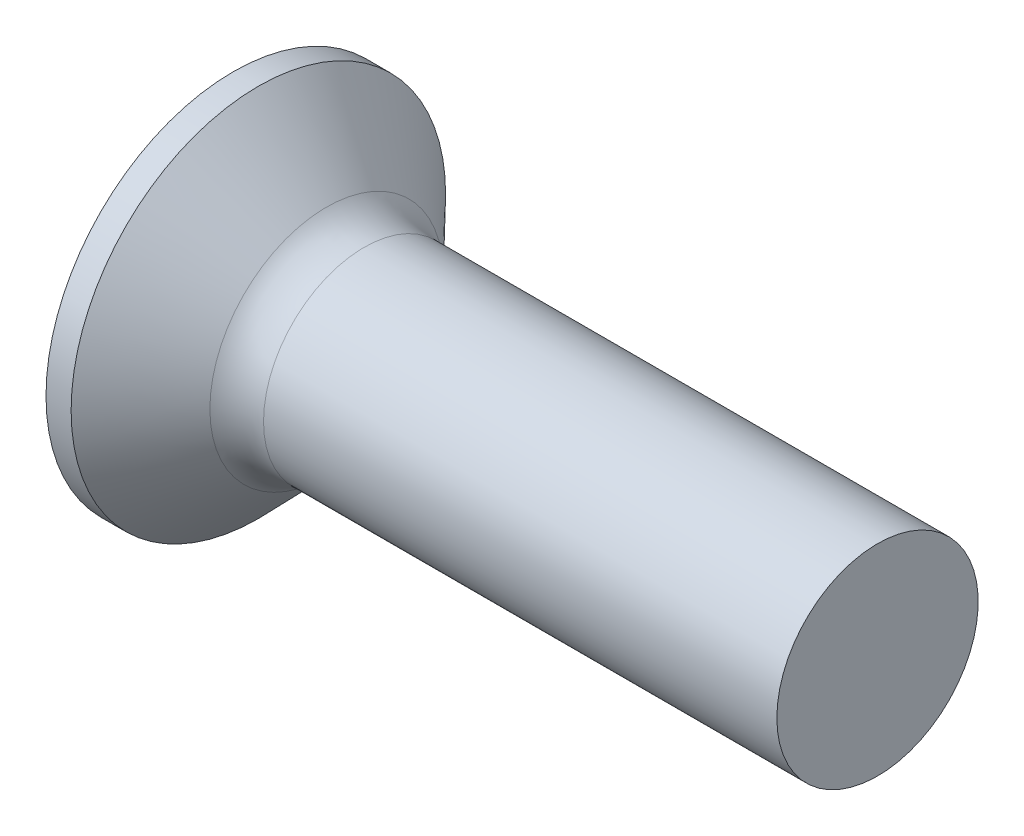
ISO-10303-21;
HEADER;
FILE_DESCRIPTION(('STEP AP214'),'2;1');
FILE_NAME('part.step','',(''),(''),'','','');
FILE_SCHEMA(('AUTOMOTIVE_DESIGN { 1 0 10303 214 1 1 1 1 }'));
ENDSEC;
DATA;
#1=APPLICATION_CONTEXT('core data for automotive mechanical design processes');
#2=APPLICATION_PROTOCOL_DEFINITION('international standard','automotive_design',2000,#1);
#3=PRODUCT_CONTEXT('',#1,'mechanical');
#4=PRODUCT('Part','Part','',(#3));
#5=PRODUCT_RELATED_PRODUCT_CATEGORY('part','',(#4));
#6=PRODUCT_DEFINITION_FORMATION('','',#4);
#7=PRODUCT_DEFINITION_CONTEXT('part definition',#1,'design');
#8=PRODUCT_DEFINITION('design','',#6,#7);
#9=PRODUCT_DEFINITION_SHAPE('','',#8);
#10=(LENGTH_UNIT() NAMED_UNIT(*) SI_UNIT(.MILLI.,.METRE.));
#11=(NAMED_UNIT(*) PLANE_ANGLE_UNIT() SI_UNIT($,.RADIAN.));
#12=(NAMED_UNIT(*) SI_UNIT($,.STERADIAN.) SOLID_ANGLE_UNIT());
#13=UNCERTAINTY_MEASURE_WITH_UNIT(LENGTH_MEASURE(1.E-05),#10,'distance_accuracy_value','');
#14=(GEOMETRIC_REPRESENTATION_CONTEXT(3) GLOBAL_UNCERTAINTY_ASSIGNED_CONTEXT((#13)) GLOBAL_UNIT_ASSIGNED_CONTEXT((#10,
#11,#12)) REPRESENTATION_CONTEXT('',''));
#15=CARTESIAN_POINT('',(0.,0.,0.));
#16=DIRECTION('',(0.,0.,1.));
#17=DIRECTION('',(1.,0.,0.));
#18=AXIS2_PLACEMENT_3D('',#15,#16,#17);
#19=CARTESIAN_POINT('',(0.,0.,0.));
#20=DIRECTION('',(-1.,0.,0.));
#21=DIRECTION('',(0.,0.,1.));
#22=AXIS2_PLACEMENT_3D('',#19,#20,#21);
#23=PLANE('',#22);
#24=CARTESIAN_POINT('',(0.,0.,0.));
#25=DIRECTION('',(-1.,0.,0.));
#26=DIRECTION('',(0.,0.,1.));
#27=AXIS2_PLACEMENT_3D('',#24,#25,#26);
#28=CIRCLE('',#27,4.65);
#29=CARTESIAN_POINT('',(0.,0.,4.65));
#30=VERTEX_POINT('',#29);
#31=EDGE_CURVE('E207',#30,#30,#28,.T.);
#32=ORIENTED_EDGE('',*,*,#31,.T.);
#33=EDGE_LOOP('',(#32));
#34=FACE_BOUND('',#33,.T.);
#35=DIRECTION('',(0.,0.,-1.));
#36=VECTOR('',#35,1.);
#37=CARTESIAN_POINT('',(0.,-0.515000000000008,2.45));
#38=LINE('',#37,#36);
#39=CARTESIAN_POINT('',(0.,-0.515000000000008,2.45));
#40=VERTEX_POINT('',#39);
#41=CARTESIAN_POINT('',(0.,-0.515000000000003,0.931375357653024));
#42=VERTEX_POINT('',#41);
#43=EDGE_CURVE('E255',#40,#42,#38,.T.);
#44=ORIENTED_EDGE('',*,*,#43,.T.);
#45=CARTESIAN_POINT('',(0.,0.,0.));
#46=DIRECTION('',(-1.,0.,0.));
#47=DIRECTION('',(0.,0.,1.));
#48=AXIS2_PLACEMENT_3D('',#45,#46,#47);
#49=CIRCLE('',#48,1.06427677642768);
#50=CARTESIAN_POINT('',(0.,-0.931375357653025,0.515));
#51=VERTEX_POINT('',#50);
#52=EDGE_CURVE('E395',#51,#42,#49,.T.);
#53=ORIENTED_EDGE('',*,*,#52,.F.);
#54=DIRECTION('',(0.,-1.,0.));
#55=VECTOR('',#54,1.);
#56=CARTESIAN_POINT('',(0.,2.45,0.515));
#57=LINE('',#56,#55);
#58=CARTESIAN_POINT('',(0.,-2.45,0.515));
#59=VERTEX_POINT('',#58);
#60=EDGE_CURVE('E222',#51,#59,#57,.T.);
#61=ORIENTED_EDGE('',*,*,#60,.T.);
#62=DIRECTION('',(0.,0.,-1.));
#63=VECTOR('',#62,1.);
#64=CARTESIAN_POINT('',(0.,-2.45,0.515));
#65=LINE('',#64,#63);
#66=CARTESIAN_POINT('',(0.,-2.45,-0.514999999999999));
#67=VERTEX_POINT('',#66);
#68=EDGE_CURVE('E211',#59,#67,#65,.T.);
#69=ORIENTED_EDGE('',*,*,#68,.T.);
#70=DIRECTION('',(0.,1.,0.));
#71=VECTOR('',#70,1.);
#72=CARTESIAN_POINT('',(0.,-2.45,-0.514999999999999));
#73=LINE('',#72,#71);
#74=CARTESIAN_POINT('',(0.,-0.931375357653026,-0.514999999999999));
#75=VERTEX_POINT('',#74);
#76=EDGE_CURVE('E212',#67,#75,#73,.T.);
#77=ORIENTED_EDGE('',*,*,#76,.T.);
#78=CARTESIAN_POINT('',(0.,-0.514999999999997,-0.931375357653027));
#79=VERTEX_POINT('',#78);
#80=EDGE_CURVE('E399',#79,#75,#49,.T.);
#81=ORIENTED_EDGE('',*,*,#80,.F.);
#82=CARTESIAN_POINT('',(0.,-0.514999999999992,-2.45));
#83=VERTEX_POINT('',#82);
#84=EDGE_CURVE('E258',#79,#83,#38,.T.);
#85=ORIENTED_EDGE('',*,*,#84,.T.);
#86=DIRECTION('',(0.,1.,0.));
#87=VECTOR('',#86,1.);
#88=CARTESIAN_POINT('',(0.,-0.514999999999992,-2.45));
#89=LINE('',#88,#87);
#90=CARTESIAN_POINT('',(0.,0.515000000000008,-2.45));
#91=VERTEX_POINT('',#90);
#92=EDGE_CURVE('E252',#83,#91,#89,.T.);
#93=ORIENTED_EDGE('',*,*,#92,.T.);
#94=DIRECTION('',(0.,0.,1.));
#95=VECTOR('',#94,1.);
#96=CARTESIAN_POINT('',(0.,0.515000000000008,-2.45));
#97=LINE('',#96,#95);
#98=CARTESIAN_POINT('',(0.,0.515000000000003,-0.931375357653024));
#99=VERTEX_POINT('',#98);
#100=EDGE_CURVE('E247',#91,#99,#97,.T.);
#101=ORIENTED_EDGE('',*,*,#100,.T.);
#102=CARTESIAN_POINT('',(0.,0.931375357653026,-0.514999999999999));
#103=VERTEX_POINT('',#102);
#104=EDGE_CURVE('E422',#103,#99,#49,.T.);
#105=ORIENTED_EDGE('',*,*,#104,.F.);
#106=CARTESIAN_POINT('',(0.,2.45,-0.514999999999999));
#107=VERTEX_POINT('',#106);
#108=EDGE_CURVE('E216',#103,#107,#73,.T.);
#109=ORIENTED_EDGE('',*,*,#108,.T.);
#110=DIRECTION('',(0.,0.,1.));
#111=VECTOR('',#110,1.);
#112=CARTESIAN_POINT('',(0.,2.45,-0.514999999999999));
#113=LINE('',#112,#111);
#114=CARTESIAN_POINT('',(0.,2.45,0.515));
#115=VERTEX_POINT('',#114);
#116=EDGE_CURVE('E215',#107,#115,#113,.T.);
#117=ORIENTED_EDGE('',*,*,#116,.T.);
#118=CARTESIAN_POINT('',(0.,0.931375357653025,0.515));
#119=VERTEX_POINT('',#118);
#120=EDGE_CURVE('E219',#115,#119,#57,.T.);
#121=ORIENTED_EDGE('',*,*,#120,.T.);
#122=CARTESIAN_POINT('',(0.,0.514999999999996,0.931375357653028));
#123=VERTEX_POINT('',#122);
#124=EDGE_CURVE('E382',#123,#119,#49,.T.);
#125=ORIENTED_EDGE('',*,*,#124,.F.);
#126=CARTESIAN_POINT('',(0.,0.514999999999991,2.45));
#127=VERTEX_POINT('',#126);
#128=EDGE_CURVE('E251',#123,#127,#97,.T.);
#129=ORIENTED_EDGE('',*,*,#128,.T.);
#130=DIRECTION('',(0.,-1.,0.));
#131=VECTOR('',#130,1.);
#132=CARTESIAN_POINT('',(0.,0.514999999999991,2.45));
#133=LINE('',#132,#131);
#134=EDGE_CURVE('E250',#127,#40,#133,.T.);
#135=ORIENTED_EDGE('',*,*,#134,.T.);
#136=EDGE_LOOP('',(#44,#53,#61,#69,#77,#81,#85,#93,#101,#105,#109,#117,#121,#125,#129,#135));
#137=FACE_BOUND('',#136,.T.);
#138=ADVANCED_FACE('F33',(#34,#137),#23,.T.);
#139=CARTESIAN_POINT('',(3.05,-0.929326147908033,0.515));
#140=DIRECTION('',(0.,0.,-1.));
#141=DIRECTION('',(0.,1.,0.));
#142=AXIS2_PLACEMENT_3D('',#139,#140,#141);
#143=PLANE('',#142);
#144=ORIENTED_EDGE('',*,*,#60,.F.);
#145=CARTESIAN_POINT('',(-1.54221347305349,-1.05291860734043,0.515));
#146=CARTESIAN_POINT('',(-1.22007147016316,-1.02783607001973,0.515));
#147=CARTESIAN_POINT('',(-0.897941816751639,-1.002592893973,0.515));
#148=CARTESIAN_POINT('',(-0.253713842852044,-0.951673528807874,0.515));
#149=CARTESIAN_POINT('',(0.0683844773279266,-0.925997335794191,0.515));
#150=CARTESIAN_POINT('',(0.712537341146251,-0.874100649412191,0.515));
#151=CARTESIAN_POINT('',(1.03459188478602,-0.847880156061488,0.515));
#152=CARTESIAN_POINT('',(1.67864013954242,-0.794723210967585,0.515));
#153=CARTESIAN_POINT('',(2.0006338510091,-0.767786763479055,0.515));
#154=CARTESIAN_POINT('',(2.56056239677504,-0.720091607539808,0.515));
#155=CARTESIAN_POINT('',(2.7985160340986,-0.699554136185311,0.515));
#156=CARTESIAN_POINT('',(3.27436149939217,-0.657782810112312,0.515));
#157=CARTESIAN_POINT('',(3.51225332755343,-0.636548957574876,0.515));
#158=CARTESIAN_POINT('',(3.98796007755392,-0.59316517097504,0.515));
#159=CARTESIAN_POINT('',(4.22577499737104,-0.571015214531953,0.515));
#160=CARTESIAN_POINT('',(4.70127802763926,-0.525368927832394,0.515));
#161=CARTESIAN_POINT('',(4.93896613655203,-0.50187258160175,0.515000000000001));
#162=CARTESIAN_POINT('',(5.17656597464715,-0.477487906778811,0.515));
#163=B_SPLINE_CURVE_WITH_KNOTS('',3,(#145,#146,#147,#148,#149,#150,#151,#152,#153,#154,#155,
#156,#157,#158,#159,#160,#161,#162),.UNSPECIFIED.,.F.,.F.,(4,2,2,2,2,2,2,2,4),(0.,
0.9693512359483,1.9387111965537,2.90807112578743,3.87742529573196,4.59393929763426,
5.3104510556289,6.0269803285681,6.74351810449256),.UNSPECIFIED.);
#164=CARTESIAN_POINT('',(3.05,-0.677477674908921,0.515));
#165=VERTEX_POINT('',#164);
#166=EDGE_CURVE('E285',#51,#165,#163,.T.);
#167=ORIENTED_EDGE('',*,*,#166,.T.);
#168=DIRECTION('',(0.,-1.,0.));
#169=VECTOR('',#168,1.);
#170=CARTESIAN_POINT('',(3.05,0.929326147908032,0.515));
#171=LINE('',#170,#169);
#172=CARTESIAN_POINT('',(3.05,-0.929326147908033,0.515));
#173=VERTEX_POINT('',#172);
#174=EDGE_CURVE('E245',#165,#173,#171,.T.);
#175=ORIENTED_EDGE('',*,*,#174,.T.);
#176=DIRECTION('',(0.89493436774996,0.446197800778958,0.));
#177=VECTOR('',#176,1.);
#178=CARTESIAN_POINT('',(0.,-2.45,0.515));
#179=LINE('',#178,#177);
#180=EDGE_CURVE('E228',#59,#173,#179,.T.);
#181=ORIENTED_EDGE('',*,*,#180,.F.);
#182=EDGE_LOOP('',(#144,#167,#175,#181));
#183=FACE_BOUND('',#182,.T.);
#184=ADVANCED_FACE('F165',(#183),#143,.T.);
#185=CARTESIAN_POINT('',(3.05,0.929326147908033,0.515));
#186=VERTEX_POINT('',#185);
#187=CARTESIAN_POINT('',(3.05,0.677477674908921,0.515));
#188=VERTEX_POINT('',#187);
#189=EDGE_CURVE('E242',#186,#188,#171,.T.);
#190=ORIENTED_EDGE('',*,*,#189,.T.);
#191=CARTESIAN_POINT('',(-1.54221347305349,1.05291860734043,0.515));
#192=CARTESIAN_POINT('',(-1.22007147016315,1.02783607001973,0.515));
#193=CARTESIAN_POINT('',(-0.897941816751639,1.002592893973,0.515));
#194=CARTESIAN_POINT('',(-0.253713842852044,0.951673528807874,0.515));
#195=CARTESIAN_POINT('',(0.0683844773279268,0.925997335794191,0.515));
#196=CARTESIAN_POINT('',(0.712537341146251,0.874100649412191,0.515));
#197=CARTESIAN_POINT('',(1.03459188478602,0.847880156061489,0.515));
#198=CARTESIAN_POINT('',(1.67864013954242,0.794723210967585,0.515));
#199=CARTESIAN_POINT('',(2.0006338510091,0.767786763479055,0.515));
#200=CARTESIAN_POINT('',(2.56056239677504,0.720091607539808,0.515));
#201=CARTESIAN_POINT('',(2.7985160340986,0.699554136185312,0.515));
#202=CARTESIAN_POINT('',(3.27436149939217,0.657782810112312,0.515));
#203=CARTESIAN_POINT('',(3.51225332755344,0.636548957574876,0.515));
#204=CARTESIAN_POINT('',(3.98796007755392,0.593165170975039,0.515));
#205=CARTESIAN_POINT('',(4.22577499737104,0.571015214531952,0.515));
#206=CARTESIAN_POINT('',(4.70127802763926,0.525368927832394,0.515));
#207=CARTESIAN_POINT('',(4.93896613655203,0.50187258160175,0.515));
#208=CARTESIAN_POINT('',(5.17656597464715,0.477487906778811,0.515));
#209=B_SPLINE_CURVE_WITH_KNOTS('',3,(#191,#192,#193,#194,#195,#196,#197,#198,#199,#200,#201,
#202,#203,#204,#205,#206,#207,#208),.UNSPECIFIED.,.F.,.F.,(4,2,2,2,2,2,2,2,4),(0.,
0.9693512359483,1.9387111965537,2.90807112578743,3.87742529573196,4.59393929763426,
5.3104510556289,6.0269803285681,6.74351810449256),.UNSPECIFIED.);
#210=EDGE_CURVE('E291',#188,#119,#209,.F.);
#211=ORIENTED_EDGE('',*,*,#210,.T.);
#212=ORIENTED_EDGE('',*,*,#120,.F.);
#213=DIRECTION('',(0.89493436774996,-0.446197800778958,0.));
#214=VECTOR('',#213,1.);
#215=CARTESIAN_POINT('',(0.,2.45,0.515));
#216=LINE('',#215,#214);
#217=EDGE_CURVE('E61',#115,#186,#216,.T.);
#218=ORIENTED_EDGE('',*,*,#217,.T.);
#219=EDGE_LOOP('',(#190,#211,#212,#218));
#220=FACE_BOUND('',#219,.T.);
#221=ADVANCED_FACE('F171',(#220),#143,.T.);
#222=CARTESIAN_POINT('',(3.05,0.929326147908033,-0.515));
#223=DIRECTION('',(0.,0.,1.));
#224=DIRECTION('',(1.,0.,0.));
#225=AXIS2_PLACEMENT_3D('',#222,#223,#224);
#226=PLANE('',#225);
#227=DIRECTION('',(0.,1.,0.));
#228=VECTOR('',#227,1.);
#229=CARTESIAN_POINT('',(3.05,-0.929326147908033,-0.515));
#230=LINE('',#229,#228);
#231=CARTESIAN_POINT('',(3.05,-0.929326147908033,-0.515));
#232=VERTEX_POINT('',#231);
#233=CARTESIAN_POINT('',(3.05,-0.677477674908921,-0.515));
#234=VERTEX_POINT('',#233);
#235=EDGE_CURVE('E236',#232,#234,#230,.T.);
#236=ORIENTED_EDGE('',*,*,#235,.T.);
#237=CARTESIAN_POINT('',(-1.54221347305349,-1.05291860734043,-0.514999999999999));
#238=CARTESIAN_POINT('',(-1.22007147016315,-1.02783607001973,-0.514999999999999));
#239=CARTESIAN_POINT('',(-0.897941816751639,-1.002592893973,-0.514999999999999));
#240=CARTESIAN_POINT('',(-0.253713842852044,-0.951673528807874,-0.514999999999999));
#241=CARTESIAN_POINT('',(0.0683844773279272,-0.925997335794192,-0.514999999999999));
#242=CARTESIAN_POINT('',(0.712537341146251,-0.874100649412191,-0.515));
#243=CARTESIAN_POINT('',(1.03459188478602,-0.847880156061489,-0.515));
#244=CARTESIAN_POINT('',(1.67864013954242,-0.794723210967585,-0.515));
#245=CARTESIAN_POINT('',(2.0006338510091,-0.767786763479056,-0.515));
#246=CARTESIAN_POINT('',(2.56056239677504,-0.720091607539808,-0.515));
#247=CARTESIAN_POINT('',(2.7985160340986,-0.699554136185312,-0.515));
#248=CARTESIAN_POINT('',(3.27436149939218,-0.657782810112312,-0.515));
#249=CARTESIAN_POINT('',(3.51225332755344,-0.636548957574876,-0.515));
#250=CARTESIAN_POINT('',(3.98796007755392,-0.593165170975039,-0.515));
#251=CARTESIAN_POINT('',(4.22577499737104,-0.571015214531952,-0.515));
#252=CARTESIAN_POINT('',(4.70127802763926,-0.525368927832394,-0.515));
#253=CARTESIAN_POINT('',(4.93896613655203,-0.50187258160175,-0.515));
#254=CARTESIAN_POINT('',(5.17656597464715,-0.477487906778811,-0.515));
#255=B_SPLINE_CURVE_WITH_KNOTS('',3,(#237,#238,#239,#240,#241,#242,#243,#244,#245,#246,#247,
#248,#249,#250,#251,#252,#253,#254),.UNSPECIFIED.,.F.,.F.,(4,2,2,2,2,2,2,2,4),(0.,
0.9693512359483,1.9387111965537,2.90807112578743,3.87742529573196,4.59393929763426,
5.3104510556289,6.0269803285681,6.74351810449256),.UNSPECIFIED.);
#256=EDGE_CURVE('E330',#234,#75,#255,.F.);
#257=ORIENTED_EDGE('',*,*,#256,.T.);
#258=ORIENTED_EDGE('',*,*,#76,.F.);
#259=DIRECTION('',(0.89493436774996,0.446197800778958,0.));
#260=VECTOR('',#259,1.);
#261=CARTESIAN_POINT('',(0.,-2.45,-0.514999999999999));
#262=LINE('',#261,#260);
#263=EDGE_CURVE('E225',#67,#232,#262,.T.);
#264=ORIENTED_EDGE('',*,*,#263,.T.);
#265=EDGE_LOOP('',(#236,#257,#258,#264));
#266=FACE_BOUND('',#265,.T.);
#267=ADVANCED_FACE('F335',(#266),#226,.T.);
#268=ORIENTED_EDGE('',*,*,#108,.F.);
#269=CARTESIAN_POINT('',(-1.54221347305349,1.05291860734043,-0.514999999999999));
#270=CARTESIAN_POINT('',(-1.22007147016316,1.02783607001973,-0.514999999999999));
#271=CARTESIAN_POINT('',(-0.897941816751639,1.002592893973,-0.514999999999999));
#272=CARTESIAN_POINT('',(-0.253713842852044,0.951673528807874,-0.514999999999999));
#273=CARTESIAN_POINT('',(0.0683844773279271,0.925997335794192,-0.514999999999999));
#274=CARTESIAN_POINT('',(0.712537341146251,0.874100649412191,-0.515));
#275=CARTESIAN_POINT('',(1.03459188478602,0.847880156061489,-0.515));
#276=CARTESIAN_POINT('',(1.67864013954242,0.794723210967585,-0.515));
#277=CARTESIAN_POINT('',(2.0006338510091,0.767786763479055,-0.515));
#278=CARTESIAN_POINT('',(2.56056239677504,0.720091607539808,-0.515));
#279=CARTESIAN_POINT('',(2.7985160340986,0.699554136185312,-0.515));
#280=CARTESIAN_POINT('',(3.27436149939217,0.657782810112313,-0.515));
#281=CARTESIAN_POINT('',(3.51225332755343,0.636548957574876,-0.515));
#282=CARTESIAN_POINT('',(3.98796007755392,0.59316517097504,-0.515));
#283=CARTESIAN_POINT('',(4.22577499737104,0.571015214531953,-0.515));
#284=CARTESIAN_POINT('',(4.70127802763926,0.525368927832394,-0.515));
#285=CARTESIAN_POINT('',(4.93896613655203,0.50187258160175,-0.515));
#286=CARTESIAN_POINT('',(5.17656597464715,0.477487906778811,-0.515));
#287=B_SPLINE_CURVE_WITH_KNOTS('',3,(#269,#270,#271,#272,#273,#274,#275,#276,#277,#278,#279,
#280,#281,#282,#283,#284,#285,#286),.UNSPECIFIED.,.F.,.F.,(4,2,2,2,2,2,2,2,4),(0.,
0.9693512359483,1.9387111965537,2.90807112578743,3.87742529573196,4.59393929763426,
5.3104510556289,6.0269803285681,6.74351810449256),.UNSPECIFIED.);
#288=CARTESIAN_POINT('',(3.05,0.677477674908921,-0.515));
#289=VERTEX_POINT('',#288);
#290=EDGE_CURVE('E326',#103,#289,#287,.T.);
#291=ORIENTED_EDGE('',*,*,#290,.T.);
#292=CARTESIAN_POINT('',(3.05,0.929326147908032,-0.515));
#293=VERTEX_POINT('',#292);
#294=EDGE_CURVE('E240',#289,#293,#230,.T.);
#295=ORIENTED_EDGE('',*,*,#294,.T.);
#296=DIRECTION('',(0.89493436774996,-0.446197800778958,0.));
#297=VECTOR('',#296,1.);
#298=CARTESIAN_POINT('',(0.,2.45,-0.514999999999999));
#299=LINE('',#298,#297);
#300=EDGE_CURVE('E232',#107,#293,#299,.T.);
#301=ORIENTED_EDGE('',*,*,#300,.F.);
#302=EDGE_LOOP('',(#268,#291,#295,#301));
#303=FACE_BOUND('',#302,.T.);
#304=ADVANCED_FACE('F339',(#303),#226,.T.);
#305=CARTESIAN_POINT('',(3.05,0.929326147908032,-0.515));
#306=DIRECTION('',(1.,0.,0.));
#307=DIRECTION('',(0.,0.,-1.));
#308=AXIS2_PLACEMENT_3D('',#305,#306,#307);
#309=PLANE('',#308);
#310=CARTESIAN_POINT('',(3.05,0.,0.));
#311=DIRECTION('',(-1.,0.,0.));
#312=DIRECTION('',(0.,0.,1.));
#313=AXIS2_PLACEMENT_3D('',#310,#311,#312);
#314=CIRCLE('',#313,0.850999999999999);
#315=EDGE_CURVE('E394',#234,#165,#314,.T.);
#316=ORIENTED_EDGE('',*,*,#315,.F.);
#317=ORIENTED_EDGE('',*,*,#235,.F.);
#318=DIRECTION('',(0.,0.,-1.));
#319=VECTOR('',#318,1.);
#320=CARTESIAN_POINT('',(3.05,-0.929326147908033,0.515));
#321=LINE('',#320,#319);
#322=EDGE_CURVE('E235',#173,#232,#321,.T.);
#323=ORIENTED_EDGE('',*,*,#322,.F.);
#324=ORIENTED_EDGE('',*,*,#174,.F.);
#325=EDGE_LOOP('',(#316,#317,#323,#324));
#326=FACE_BOUND('',#325,.T.);
#327=ADVANCED_FACE('F347',(#326),#309,.F.);
#328=CARTESIAN_POINT('',(3.05,-0.515000000000003,0.677477674908919));
#329=VERTEX_POINT('',#328);
#330=CARTESIAN_POINT('',(3.05,0.514999999999998,0.677477674908923));
#331=VERTEX_POINT('',#330);
#332=EDGE_CURVE('E390',#329,#331,#314,.T.);
#333=ORIENTED_EDGE('',*,*,#332,.F.);
#334=DIRECTION('',(0.,0.,-1.));
#335=VECTOR('',#334,1.);
#336=CARTESIAN_POINT('',(3.05,-0.515000000000003,0.929326147908031));
#337=LINE('',#336,#335);
#338=CARTESIAN_POINT('',(3.05,-0.515000000000003,0.929326147908031));
#339=VERTEX_POINT('',#338);
#340=EDGE_CURVE('E279',#339,#329,#337,.T.);
#341=ORIENTED_EDGE('',*,*,#340,.F.);
#342=DIRECTION('',(0.,-1.,0.));
#343=VECTOR('',#342,1.);
#344=CARTESIAN_POINT('',(3.05,0.514999999999997,0.929326147908034));
#345=LINE('',#344,#343);
#346=CARTESIAN_POINT('',(3.05,0.514999999999997,0.929326147908034));
#347=VERTEX_POINT('',#346);
#348=EDGE_CURVE('E276',#347,#339,#345,.T.);
#349=ORIENTED_EDGE('',*,*,#348,.F.);
#350=DIRECTION('',(0.,0.,1.));
#351=VECTOR('',#350,1.);
#352=CARTESIAN_POINT('',(3.05,0.515000000000003,-0.929326147908031));
#353=LINE('',#352,#351);
#354=EDGE_CURVE('E277',#331,#347,#353,.T.);
#355=ORIENTED_EDGE('',*,*,#354,.F.);
#356=EDGE_LOOP('',(#333,#341,#349,#355));
#357=FACE_BOUND('',#356,.T.);
#358=ADVANCED_FACE('F350',(#357),#309,.F.);
#359=EDGE_CURVE('E396',#188,#289,#314,.T.);
#360=ORIENTED_EDGE('',*,*,#359,.F.);
#361=ORIENTED_EDGE('',*,*,#189,.F.);
#362=DIRECTION('',(0.,0.,1.));
#363=VECTOR('',#362,1.);
#364=CARTESIAN_POINT('',(3.05,0.929326147908032,-0.515));
#365=LINE('',#364,#363);
#366=EDGE_CURVE('E239',#293,#186,#365,.T.);
#367=ORIENTED_EDGE('',*,*,#366,.F.);
#368=ORIENTED_EDGE('',*,*,#294,.F.);
#369=EDGE_LOOP('',(#360,#361,#367,#368));
#370=FACE_BOUND('',#369,.T.);
#371=ADVANCED_FACE('F369',(#370),#309,.F.);
#372=CARTESIAN_POINT('',(3.05,0.515000000000002,-0.677477674908919));
#373=VERTEX_POINT('',#372);
#374=CARTESIAN_POINT('',(3.05,-0.514999999999998,-0.677477674908923));
#375=VERTEX_POINT('',#374);
#376=EDGE_CURVE('E403',#373,#375,#314,.T.);
#377=ORIENTED_EDGE('',*,*,#376,.F.);
#378=CARTESIAN_POINT('',(3.05,0.515000000000003,-0.929326147908031));
#379=VERTEX_POINT('',#378);
#380=EDGE_CURVE('E273',#379,#373,#353,.T.);
#381=ORIENTED_EDGE('',*,*,#380,.F.);
#382=DIRECTION('',(0.,1.,0.));
#383=VECTOR('',#382,1.);
#384=CARTESIAN_POINT('',(3.05,-0.514999999999997,-0.929326147908035));
#385=LINE('',#384,#383);
#386=CARTESIAN_POINT('',(3.05,-0.514999999999997,-0.929326147908035));
#387=VERTEX_POINT('',#386);
#388=EDGE_CURVE('E272',#387,#379,#385,.T.);
#389=ORIENTED_EDGE('',*,*,#388,.F.);
#390=EDGE_CURVE('E282',#375,#387,#337,.T.);
#391=ORIENTED_EDGE('',*,*,#390,.F.);
#392=EDGE_LOOP('',(#377,#381,#389,#391));
#393=FACE_BOUND('',#392,.T.);
#394=ADVANCED_FACE('F352',(#393),#309,.F.);
#395=CARTESIAN_POINT('',(3.05,0.514999999999997,0.929326147908034));
#396=DIRECTION('',(0.,-1.,0.));
#397=DIRECTION('',(1.,0.,0.));
#398=AXIS2_PLACEMENT_3D('',#395,#396,#397);
#399=PLANE('',#398);
#400=ORIENTED_EDGE('',*,*,#380,.T.);
#401=CARTESIAN_POINT('',(-1.54221347305349,0.515000000000003,-1.05291860734043));
#402=CARTESIAN_POINT('',(-1.22007147016316,0.515000000000003,-1.02783607001973));
#403=CARTESIAN_POINT('',(-0.897941816751639,0.515000000000003,-1.002592893973));
#404=CARTESIAN_POINT('',(-0.253713842852044,0.515000000000003,-0.951673528807872));
#405=CARTESIAN_POINT('',(0.0683844773279268,0.515000000000003,-0.92599733579419));
#406=CARTESIAN_POINT('',(0.712537341146251,0.515000000000003,-0.874100649412189));
#407=CARTESIAN_POINT('',(1.03459188478602,0.515000000000003,-0.847880156061487));
#408=CARTESIAN_POINT('',(1.67864013954242,0.515000000000003,-0.794723210967583));
#409=CARTESIAN_POINT('',(2.0006338510091,0.515000000000002,-0.767786763479054));
#410=CARTESIAN_POINT('',(2.56056239677504,0.515000000000002,-0.720091607539806));
#411=CARTESIAN_POINT('',(2.7985160340986,0.515000000000002,-0.69955413618531));
#412=CARTESIAN_POINT('',(3.27436149939217,0.515000000000002,-0.657782810112311));
#413=CARTESIAN_POINT('',(3.51225332755344,0.515000000000002,-0.636548957574874));
#414=CARTESIAN_POINT('',(3.98796007755392,0.515000000000002,-0.593165170975038));
#415=CARTESIAN_POINT('',(4.22577499737104,0.515000000000002,-0.571015214531951));
#416=CARTESIAN_POINT('',(4.70127802763926,0.515000000000002,-0.525368927832392));
#417=CARTESIAN_POINT('',(4.93896613655203,0.515000000000002,-0.501872581601748));
#418=CARTESIAN_POINT('',(5.17656597464715,0.515000000000002,-0.47748790677881));
#419=B_SPLINE_CURVE_WITH_KNOTS('',3,(#401,#402,#403,#404,#405,#406,#407,#408,#409,#410,#411,
#412,#413,#414,#415,#416,#417,#418),.UNSPECIFIED.,.F.,.F.,(4,2,2,2,2,2,2,2,4),(0.,
0.9693512359483,1.9387111965537,2.90807112578743,3.87742529573196,4.59393929763426,
5.3104510556289,6.0269803285681,6.74351810449256),.UNSPECIFIED.);
#420=EDGE_CURVE('E320',#373,#99,#419,.F.);
#421=ORIENTED_EDGE('',*,*,#420,.T.);
#422=ORIENTED_EDGE('',*,*,#100,.F.);
#423=DIRECTION('',(0.89493436774996,0.,0.446197800778958));
#424=VECTOR('',#423,1.);
#425=CARTESIAN_POINT('',(0.,0.515000000000008,-2.45));
#426=LINE('',#425,#424);
#427=EDGE_CURVE('E261',#91,#379,#426,.T.);
#428=ORIENTED_EDGE('',*,*,#427,.T.);
#429=EDGE_LOOP('',(#400,#421,#422,#428));
#430=FACE_BOUND('',#429,.T.);
#431=ADVANCED_FACE('F359',(#430),#399,.T.);
#432=CARTESIAN_POINT('',(3.05,-0.514999999999997,-0.929326147908035));
#433=DIRECTION('',(0.,1.,0.));
#434=DIRECTION('',(0.,0.,1.));
#435=AXIS2_PLACEMENT_3D('',#432,#433,#434);
#436=PLANE('',#435);
#437=ORIENTED_EDGE('',*,*,#84,.F.);
#438=CARTESIAN_POINT('',(-1.54221347305349,-0.514999999999996,-1.05291860734043));
#439=CARTESIAN_POINT('',(-1.22007147016315,-0.514999999999996,-1.02783607001974));
#440=CARTESIAN_POINT('',(-0.897941816751639,-0.514999999999996,-1.002592893973));
#441=CARTESIAN_POINT('',(-0.253713842852044,-0.514999999999997,-0.951673528807876));
#442=CARTESIAN_POINT('',(0.0683844773279269,-0.514999999999997,-0.925997335794193));
#443=CARTESIAN_POINT('',(0.712537341146251,-0.514999999999997,-0.874100649412193));
#444=CARTESIAN_POINT('',(1.03459188478602,-0.514999999999997,-0.84788015606149));
#445=CARTESIAN_POINT('',(1.67864013954242,-0.514999999999997,-0.794723210967586));
#446=CARTESIAN_POINT('',(2.0006338510091,-0.514999999999998,-0.767786763479057));
#447=CARTESIAN_POINT('',(2.56056239677504,-0.514999999999998,-0.72009160753981));
#448=CARTESIAN_POINT('',(2.7985160340986,-0.514999999999998,-0.699554136185313));
#449=CARTESIAN_POINT('',(3.27436149939217,-0.514999999999998,-0.657782810112314));
#450=CARTESIAN_POINT('',(3.51225332755344,-0.514999999999998,-0.636548957574877));
#451=CARTESIAN_POINT('',(3.98796007755392,-0.514999999999998,-0.593165170975041));
#452=CARTESIAN_POINT('',(4.22577499737104,-0.514999999999998,-0.571015214531954));
#453=CARTESIAN_POINT('',(4.70127802763926,-0.514999999999999,-0.525368927832395));
#454=CARTESIAN_POINT('',(4.93896613655203,-0.514999999999999,-0.501872581601752));
#455=CARTESIAN_POINT('',(5.17656597464715,-0.514999999999999,-0.477487906778813));
#456=B_SPLINE_CURVE_WITH_KNOTS('',3,(#438,#439,#440,#441,#442,#443,#444,#445,#446,#447,#448,
#449,#450,#451,#452,#453,#454,#455),.UNSPECIFIED.,.F.,.F.,(4,2,2,2,2,2,2,2,4),(0.,
0.9693512359483,1.9387111965537,2.90807112578743,3.87742529573196,4.59393929763426,
5.3104510556289,6.0269803285681,6.74351810449256),.UNSPECIFIED.);
#457=EDGE_CURVE('E314',#79,#375,#456,.T.);
#458=ORIENTED_EDGE('',*,*,#457,.T.);
#459=ORIENTED_EDGE('',*,*,#390,.T.);
#460=DIRECTION('',(0.89493436774996,0.,0.446197800778958));
#461=VECTOR('',#460,1.);
#462=CARTESIAN_POINT('',(0.,-0.514999999999992,-2.45));
#463=LINE('',#462,#461);
#464=EDGE_CURVE('E264',#83,#387,#463,.T.);
#465=ORIENTED_EDGE('',*,*,#464,.F.);
#466=EDGE_LOOP('',(#437,#458,#459,#465));
#467=FACE_BOUND('',#466,.T.);
#468=ADVANCED_FACE('F355',(#467),#436,.T.);
#469=ORIENTED_EDGE('',*,*,#340,.T.);
#470=CARTESIAN_POINT('',(-1.54221347305349,-0.515000000000003,1.05291860734043));
#471=CARTESIAN_POINT('',(-1.22007147016316,-0.515000000000003,1.02783607001973));
#472=CARTESIAN_POINT('',(-0.897941816751639,-0.515000000000003,1.002592893973));
#473=CARTESIAN_POINT('',(-0.253713842852044,-0.515000000000003,0.951673528807872));
#474=CARTESIAN_POINT('',(0.0683844773279268,-0.515000000000003,0.92599733579419));
#475=CARTESIAN_POINT('',(0.712537341146251,-0.515000000000003,0.874100649412189));
#476=CARTESIAN_POINT('',(1.03459188478602,-0.515000000000003,0.847880156061487));
#477=CARTESIAN_POINT('',(1.67864013954242,-0.515000000000003,0.794723210967583));
#478=CARTESIAN_POINT('',(2.0006338510091,-0.515000000000003,0.767786763479053));
#479=CARTESIAN_POINT('',(2.56056239677504,-0.515000000000003,0.720091607539806));
#480=CARTESIAN_POINT('',(2.7985160340986,-0.515000000000003,0.69955413618531));
#481=CARTESIAN_POINT('',(3.27436149939217,-0.515000000000003,0.657782810112311));
#482=CARTESIAN_POINT('',(3.51225332755344,-0.515000000000003,0.636548957574874));
#483=CARTESIAN_POINT('',(3.98796007755392,-0.515000000000002,0.593165170975038));
#484=CARTESIAN_POINT('',(4.22577499737104,-0.515000000000002,0.571015214531951));
#485=CARTESIAN_POINT('',(4.70127802763926,-0.515000000000002,0.525368927832392));
#486=CARTESIAN_POINT('',(4.93896613655203,-0.515000000000002,0.501872581601748));
#487=CARTESIAN_POINT('',(5.17656597464715,-0.515000000000002,0.47748790677881));
#488=B_SPLINE_CURVE_WITH_KNOTS('',3,(#470,#471,#472,#473,#474,#475,#476,#477,#478,#479,#480,
#481,#482,#483,#484,#485,#486,#487),.UNSPECIFIED.,.F.,.F.,(4,2,2,2,2,2,2,2,4),(0.,
0.9693512359483,1.9387111965537,2.90807112578743,3.87742529573196,4.59393929763426,
5.3104510556289,6.0269803285681,6.74351810449256),.UNSPECIFIED.);
#489=EDGE_CURVE('E306',#329,#42,#488,.F.);
#490=ORIENTED_EDGE('',*,*,#489,.T.);
#491=ORIENTED_EDGE('',*,*,#43,.F.);
#492=DIRECTION('',(0.89493436774996,0.,-0.446197800778958));
#493=VECTOR('',#492,1.);
#494=CARTESIAN_POINT('',(0.,-0.515000000000008,2.45));
#495=LINE('',#494,#493);
#496=EDGE_CURVE('E265',#40,#339,#495,.T.);
#497=ORIENTED_EDGE('',*,*,#496,.T.);
#498=EDGE_LOOP('',(#469,#490,#491,#497));
#499=FACE_BOUND('',#498,.T.);
#500=ADVANCED_FACE('F358',(#499),#436,.T.);
#501=ORIENTED_EDGE('',*,*,#128,.F.);
#502=CARTESIAN_POINT('',(-1.54221347305349,0.514999999999995,1.05291860734043));
#503=CARTESIAN_POINT('',(-1.22007147016315,0.514999999999995,1.02783607001974));
#504=CARTESIAN_POINT('',(-0.897941816751639,0.514999999999996,1.002592893973));
#505=CARTESIAN_POINT('',(-0.253713842852044,0.514999999999996,0.951673528807876));
#506=CARTESIAN_POINT('',(0.0683844773279271,0.514999999999996,0.925997335794193));
#507=CARTESIAN_POINT('',(0.712537341146252,0.514999999999996,0.874100649412193));
#508=CARTESIAN_POINT('',(1.03459188478602,0.514999999999997,0.84788015606149));
#509=CARTESIAN_POINT('',(1.67864013954242,0.514999999999997,0.794723210967587));
#510=CARTESIAN_POINT('',(2.0006338510091,0.514999999999997,0.767786763479057));
#511=CARTESIAN_POINT('',(2.56056239677504,0.514999999999997,0.72009160753981));
#512=CARTESIAN_POINT('',(2.7985160340986,0.514999999999998,0.699554136185313));
#513=CARTESIAN_POINT('',(3.27436149939218,0.514999999999998,0.657782810112314));
#514=CARTESIAN_POINT('',(3.51225332755344,0.514999999999998,0.636548957574878));
#515=CARTESIAN_POINT('',(3.98796007755392,0.514999999999998,0.593165170975041));
#516=CARTESIAN_POINT('',(4.22577499737104,0.514999999999998,0.571015214531954));
#517=CARTESIAN_POINT('',(4.70127802763926,0.514999999999999,0.525368927832395));
#518=CARTESIAN_POINT('',(4.93896613655203,0.514999999999999,0.501872581601752));
#519=CARTESIAN_POINT('',(5.17656597464715,0.514999999999999,0.477487906778813));
#520=B_SPLINE_CURVE_WITH_KNOTS('',3,(#502,#503,#504,#505,#506,#507,#508,#509,#510,#511,#512,
#513,#514,#515,#516,#517,#518,#519),.UNSPECIFIED.,.F.,.F.,(4,2,2,2,2,2,2,2,4),(0.,
0.9693512359483,1.9387111965537,2.90807112578744,3.87742529573196,4.59393929763426,
5.3104510556289,6.0269803285681,6.74351810449256),.UNSPECIFIED.);
#521=EDGE_CURVE('E11',#123,#331,#520,.T.);
#522=ORIENTED_EDGE('',*,*,#521,.T.);
#523=ORIENTED_EDGE('',*,*,#354,.T.);
#524=DIRECTION('',(0.89493436774996,0.,-0.446197800778958));
#525=VECTOR('',#524,1.);
#526=CARTESIAN_POINT('',(0.,0.514999999999991,2.45));
#527=LINE('',#526,#525);
#528=EDGE_CURVE('E269',#127,#347,#527,.T.);
#529=ORIENTED_EDGE('',*,*,#528,.F.);
#530=EDGE_LOOP('',(#501,#522,#523,#529));
#531=FACE_BOUND('',#530,.T.);
#532=ADVANCED_FACE('F193',(#531),#399,.T.);
#533=CARTESIAN_POINT('',(16.,2.5,0.));
#534=DIRECTION('',(1.,0.,0.));
#535=DIRECTION('',(0.,0.,-1.));
#536=AXIS2_PLACEMENT_3D('',#533,#534,#535);
#537=PLANE('',#536);
#538=CARTESIAN_POINT('',(16.,0.,0.));
#539=DIRECTION('',(-1.,0.,0.));
#540=DIRECTION('',(0.,0.,1.));
#541=AXIS2_PLACEMENT_3D('',#538,#539,#540);
#542=CIRCLE('',#541,2.5);
#543=CARTESIAN_POINT('',(16.,0.,2.5));
#544=VERTEX_POINT('',#543);
#545=EDGE_CURVE('E200',#544,#544,#542,.T.);
#546=ORIENTED_EDGE('',*,*,#545,.F.);
#547=EDGE_LOOP('',(#546));
#548=FACE_BOUND('',#547,.T.);
#549=ADVANCED_FACE('F35',(#548),#537,.T.);
#550=CARTESIAN_POINT('',(-6.34999999999999,0.,0.));
#551=DIRECTION('',(-1.,0.,0.));
#552=DIRECTION('',(0.,0.,1.));
#553=AXIS2_PLACEMENT_3D('',#550,#551,#552);
#554=CYLINDRICAL_SURFACE('',#553,2.5);
#555=CARTESIAN_POINT('',(3.25181726107249,0.,0.));
#556=DIRECTION('',(-1.,0.,0.));
#557=DIRECTION('',(0.,0.,1.));
#558=AXIS2_PLACEMENT_3D('',#555,#556,#557);
#559=CIRCLE('',#558,2.5);
#560=CARTESIAN_POINT('',(3.25181726107249,0.,2.5));
#561=VERTEX_POINT('',#560);
#562=EDGE_CURVE('E46',#561,#561,#559,.F.);
#563=ORIENTED_EDGE('',*,*,#562,.T.);
#564=EDGE_LOOP('',(#563));
#565=FACE_BOUND('',#564,.T.);
#566=ORIENTED_EDGE('',*,*,#545,.T.);
#567=EDGE_LOOP('',(#566));
#568=FACE_BOUND('',#567,.T.);
#569=ADVANCED_FACE('F186',(#565,#568),#554,.T.);
#570=CARTESIAN_POINT('',(0.623769134164798,0.,0.));
#571=DIRECTION('',(-1.,0.,0.));
#572=DIRECTION('',(0.,0.,1.));
#573=AXIS2_PLACEMENT_3D('',#570,#571,#572);
#574=CONICAL_SURFACE('',#573,4.65,0.802851455917393);
#575=CARTESIAN_POINT('',(2.31667552063224,0.,0.));
#576=DIRECTION('',(-1.,0.,0.));
#577=DIRECTION('',(0.,0.,1.));
#578=AXIS2_PLACEMENT_3D('',#575,#576,#577);
#579=CIRCLE('',#578,2.89694411840331);
#580=CARTESIAN_POINT('',(2.31667552063224,0.,2.89694411840331));
#581=VERTEX_POINT('',#580);
#582=EDGE_CURVE('E201',#581,#581,#579,.T.);
#583=ORIENTED_EDGE('',*,*,#582,.T.);
#584=EDGE_LOOP('',(#583));
#585=FACE_BOUND('',#584,.T.);
#586=CARTESIAN_POINT('',(0.623769134164798,0.,0.));
#587=DIRECTION('',(-1.,0.,0.));
#588=DIRECTION('',(0.,0.,1.));
#589=AXIS2_PLACEMENT_3D('',#586,#587,#588);
#590=CIRCLE('',#589,4.65);
#591=CARTESIAN_POINT('',(0.623769134164798,0.,4.65));
#592=VERTEX_POINT('',#591);
#593=EDGE_CURVE('E202',#592,#592,#590,.T.);
#594=ORIENTED_EDGE('',*,*,#593,.F.);
#595=EDGE_LOOP('',(#594));
#596=FACE_BOUND('',#595,.T.);
#597=ADVANCED_FACE('F183',(#585,#596),#574,.T.);
#598=CARTESIAN_POINT('',(-6.34999999999999,0.,0.));
#599=DIRECTION('',(-1.,0.,0.));
#600=DIRECTION('',(0.,0.,1.));
#601=AXIS2_PLACEMENT_3D('',#598,#599,#600);
#602=CYLINDRICAL_SURFACE('',#601,4.65);
#603=ORIENTED_EDGE('',*,*,#593,.T.);
#604=EDGE_LOOP('',(#603));
#605=FACE_BOUND('',#604,.T.);
#606=ORIENTED_EDGE('',*,*,#31,.F.);
#607=EDGE_LOOP('',(#606));
#608=FACE_BOUND('',#607,.T.);
#609=ADVANCED_FACE('F180',(#605,#608),#602,.T.);
#610=CARTESIAN_POINT('',(3.25181726107249,0.,0.));
#611=DIRECTION('',(-1.,0.,0.));
#612=DIRECTION('',(0.,0.,1.));
#613=AXIS2_PLACEMENT_3D('',#610,#611,#612);
#614=TOROIDAL_SURFACE('',#613,3.8,1.3);
#615=ORIENTED_EDGE('',*,*,#562,.F.);
#616=EDGE_LOOP('',(#615));
#617=FACE_BOUND('',#616,.T.);
#618=ORIENTED_EDGE('',*,*,#582,.F.);
#619=EDGE_LOOP('',(#618));
#620=FACE_BOUND('',#619,.T.);
#621=ADVANCED_FACE('F178',(#617,#620),#614,.F.);
#622=CARTESIAN_POINT('',(3.05,-0.929326147908033,-0.515));
#623=DIRECTION('',(-0.446197800778958,0.89493436774996,0.));
#624=DIRECTION('',(-0.89493436774996,-0.446197800778958,0.));
#625=AXIS2_PLACEMENT_3D('',#622,#623,#624);
#626=PLANE('',#625);
#627=ORIENTED_EDGE('',*,*,#263,.F.);
#628=ORIENTED_EDGE('',*,*,#68,.F.);
#629=ORIENTED_EDGE('',*,*,#180,.T.);
#630=ORIENTED_EDGE('',*,*,#322,.T.);
#631=EDGE_LOOP('',(#627,#628,#629,#630));
#632=FACE_BOUND('',#631,.T.);
#633=ADVANCED_FACE('F346',(#632),#626,.T.);
#634=CARTESIAN_POINT('',(3.05,0.929326147908032,0.515));
#635=DIRECTION('',(-0.446197800778958,-0.894934367749961,0.));
#636=DIRECTION('',(0.89493436774996,-0.446197800778958,0.));
#637=AXIS2_PLACEMENT_3D('',#634,#635,#636);
#638=PLANE('',#637);
#639=ORIENTED_EDGE('',*,*,#217,.F.);
#640=ORIENTED_EDGE('',*,*,#116,.F.);
#641=ORIENTED_EDGE('',*,*,#300,.T.);
#642=ORIENTED_EDGE('',*,*,#366,.T.);
#643=EDGE_LOOP('',(#639,#640,#641,#642));
#644=FACE_BOUND('',#643,.T.);
#645=ADVANCED_FACE('F341',(#644),#638,.T.);
#646=CARTESIAN_POINT('',(3.05,0.515000000000003,-0.929326147908031));
#647=DIRECTION('',(-0.446197800778958,0.,0.89493436774996));
#648=DIRECTION('',(-0.89493436774996,0.,-0.446197800778958));
#649=AXIS2_PLACEMENT_3D('',#646,#647,#648);
#650=PLANE('',#649);
#651=ORIENTED_EDGE('',*,*,#427,.F.);
#652=ORIENTED_EDGE('',*,*,#92,.F.);
#653=ORIENTED_EDGE('',*,*,#464,.T.);
#654=ORIENTED_EDGE('',*,*,#388,.T.);
#655=EDGE_LOOP('',(#651,#652,#653,#654));
#656=FACE_BOUND('',#655,.T.);
#657=ADVANCED_FACE('F345',(#656),#650,.T.);
#658=CARTESIAN_POINT('',(3.05,-0.515000000000003,0.929326147908031));
#659=DIRECTION('',(-0.446197800778958,0.,-0.894934367749961));
#660=DIRECTION('',(0.89493436774996,0.,-0.446197800778958));
#661=AXIS2_PLACEMENT_3D('',#658,#659,#660);
#662=PLANE('',#661);
#663=ORIENTED_EDGE('',*,*,#496,.F.);
#664=ORIENTED_EDGE('',*,*,#134,.F.);
#665=ORIENTED_EDGE('',*,*,#528,.T.);
#666=ORIENTED_EDGE('',*,*,#348,.T.);
#667=EDGE_LOOP('',(#663,#664,#665,#666));
#668=FACE_BOUND('',#667,.T.);
#669=ADVANCED_FACE('F300',(#668),#662,.T.);
#670=CARTESIAN_POINT('',(3.05,0.,0.));
#671=DIRECTION('',(-1.,0.,0.));
#672=DIRECTION('',(0.,0.,1.));
#673=AXIS2_PLACEMENT_3D('',#670,#671,#672);
#674=CONICAL_SURFACE('',#673,0.850999999999999,0.0698131700797659);
#675=ORIENTED_EDGE('',*,*,#52,.T.);
#676=ORIENTED_EDGE('',*,*,#489,.F.);
#677=EDGE_CURVE('E392',#165,#329,#314,.T.);
#678=ORIENTED_EDGE('',*,*,#677,.F.);
#679=ORIENTED_EDGE('',*,*,#166,.F.);
#680=EDGE_LOOP('',(#675,#676,#678,#679));
#681=FACE_BOUND('',#680,.T.);
#682=ADVANCED_FACE('F163',(#681),#674,.F.);
#683=EDGE_CURVE('E53',#331,#188,#314,.T.);
#684=ORIENTED_EDGE('',*,*,#683,.F.);
#685=ORIENTED_EDGE('',*,*,#521,.F.);
#686=ORIENTED_EDGE('',*,*,#124,.T.);
#687=ORIENTED_EDGE('',*,*,#210,.F.);
#688=EDGE_LOOP('',(#684,#685,#686,#687));
#689=FACE_BOUND('',#688,.T.);
#690=ADVANCED_FACE('F442',(#689),#674,.F.);
#691=ORIENTED_EDGE('',*,*,#104,.T.);
#692=ORIENTED_EDGE('',*,*,#420,.F.);
#693=EDGE_CURVE('E400',#289,#373,#314,.T.);
#694=ORIENTED_EDGE('',*,*,#693,.F.);
#695=ORIENTED_EDGE('',*,*,#290,.F.);
#696=EDGE_LOOP('',(#691,#692,#694,#695));
#697=FACE_BOUND('',#696,.T.);
#698=ADVANCED_FACE('F161',(#697),#674,.F.);
#699=EDGE_CURVE('E406',#375,#234,#314,.T.);
#700=ORIENTED_EDGE('',*,*,#699,.F.);
#701=ORIENTED_EDGE('',*,*,#457,.F.);
#702=ORIENTED_EDGE('',*,*,#80,.T.);
#703=ORIENTED_EDGE('',*,*,#256,.F.);
#704=EDGE_LOOP('',(#700,#701,#702,#703));
#705=FACE_BOUND('',#704,.T.);
#706=ADVANCED_FACE('F155',(#705),#674,.F.);
#707=CARTESIAN_POINT('',(3.3265066614942,0.,0.));
#708=DIRECTION('',(-1.,0.,0.));
#709=DIRECTION('',(0.,0.,1.));
#710=AXIS2_PLACEMENT_3D('',#707,#708,#709);
#711=CONICAL_SURFACE('',#710,0.,1.25663706143592);
#712=ORIENTED_EDGE('',*,*,#683,.T.);
#713=ORIENTED_EDGE('',*,*,#359,.T.);
#714=ORIENTED_EDGE('',*,*,#693,.T.);
#715=ORIENTED_EDGE('',*,*,#376,.T.);
#716=ORIENTED_EDGE('',*,*,#699,.T.);
#717=ORIENTED_EDGE('',*,*,#315,.T.);
#718=ORIENTED_EDGE('',*,*,#677,.T.);
#719=ORIENTED_EDGE('',*,*,#332,.T.);
#720=EDGE_LOOP('',(#712,#713,#714,#715,#716,#717,#718,#719));
#721=FACE_BOUND('',#720,.T.);
#722=CARTESIAN_POINT('',(3.3265066614942,0.,0.));
#723=VERTEX_POINT('',#722);
#724=VERTEX_LOOP('',#723);
#725=FACE_BOUND('',#724,.T.);
#726=ADVANCED_FACE('F153',(#721,#725),#711,.F.);
#727=CLOSED_SHELL('',(#138,#184,#221,#267,#304,#327,#358,#371,#394,#431,#468,#500,#532,#549,
#569,#597,#609,#621,#633,#645,#657,#669,#682,#690,#698,#706,#726));
#728=MANIFOLD_SOLID_BREP('B2',#727);
#729=ADVANCED_BREP_SHAPE_REPRESENTATION('',(#18,#728),#14);
#730=SHAPE_DEFINITION_REPRESENTATION(#9,#729);
ENDSEC;
END-ISO-10303-21;
